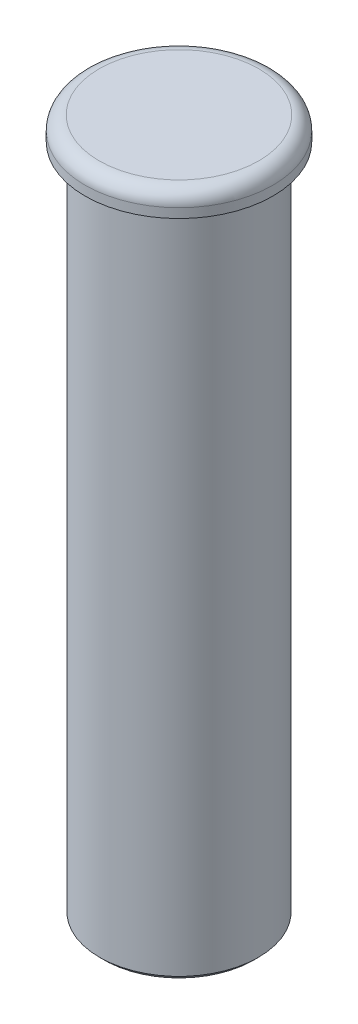
ISO-10303-21;
HEADER;
FILE_DESCRIPTION(('STEP AP214'),'2;1');
FILE_NAME('part.step','',(''),(''),'','','');
FILE_SCHEMA(('AUTOMOTIVE_DESIGN { 1 0 10303 214 1 1 1 1 }'));
ENDSEC;
DATA;
#1=APPLICATION_CONTEXT('core data for automotive mechanical design processes');
#2=APPLICATION_PROTOCOL_DEFINITION('international standard','automotive_design',2000,#1);
#3=PRODUCT_CONTEXT('',#1,'mechanical');
#4=PRODUCT('Part','Part','',(#3));
#5=PRODUCT_RELATED_PRODUCT_CATEGORY('part','',(#4));
#6=PRODUCT_DEFINITION_FORMATION('','',#4);
#7=PRODUCT_DEFINITION_CONTEXT('part definition',#1,'design');
#8=PRODUCT_DEFINITION('design','',#6,#7);
#9=PRODUCT_DEFINITION_SHAPE('','',#8);
#10=(LENGTH_UNIT() NAMED_UNIT(*) SI_UNIT(.MILLI.,.METRE.));
#11=(NAMED_UNIT(*) PLANE_ANGLE_UNIT() SI_UNIT($,.RADIAN.));
#12=(NAMED_UNIT(*) SI_UNIT($,.STERADIAN.) SOLID_ANGLE_UNIT());
#13=UNCERTAINTY_MEASURE_WITH_UNIT(LENGTH_MEASURE(1.E-05),#10,'distance_accuracy_value','');
#14=(GEOMETRIC_REPRESENTATION_CONTEXT(3) GLOBAL_UNCERTAINTY_ASSIGNED_CONTEXT((#13)) GLOBAL_UNIT_ASSIGNED_CONTEXT((#10,
#11,#12)) REPRESENTATION_CONTEXT('',''));
#15=CARTESIAN_POINT('',(0.,0.,0.));
#16=DIRECTION('',(0.,0.,1.));
#17=DIRECTION('',(1.,0.,0.));
#18=AXIS2_PLACEMENT_3D('',#15,#16,#17);
#19=CARTESIAN_POINT('',(0.,37.,0.));
#20=DIRECTION('',(0.,1.,0.));
#21=DIRECTION('',(0.,0.,1.));
#22=AXIS2_PLACEMENT_3D('',#19,#20,#21);
#23=CYLINDRICAL_SURFACE('',#22,9.99999999999999);
#24=CARTESIAN_POINT('',(0.,35.5,0.));
#25=DIRECTION('',(0.,1.,0.));
#26=DIRECTION('',(0.,0.,1.));
#27=AXIS2_PLACEMENT_3D('',#24,#25,#26);
#28=CIRCLE('',#27,9.99999999999999);
#29=CARTESIAN_POINT('',(0.,35.5,9.99999999999999));
#30=VERTEX_POINT('',#29);
#31=EDGE_CURVE('E51',#30,#30,#28,.F.);
#32=ORIENTED_EDGE('',*,*,#31,.T.);
#33=EDGE_LOOP('',(#32));
#34=FACE_BOUND('',#33,.T.);
#35=CARTESIAN_POINT('',(0.,34.5,0.));
#36=DIRECTION('',(0.,1.,0.));
#37=DIRECTION('',(0.,0.,1.));
#38=AXIS2_PLACEMENT_3D('',#35,#36,#37);
#39=CIRCLE('',#38,9.99999999999999);
#40=CARTESIAN_POINT('',(0.,34.5,9.99999999999999));
#41=VERTEX_POINT('',#40);
#42=EDGE_CURVE('E57',#41,#41,#39,.T.);
#43=ORIENTED_EDGE('',*,*,#42,.T.);
#44=EDGE_LOOP('',(#43));
#45=FACE_BOUND('',#44,.T.);
#46=ADVANCED_FACE('F31',(#34,#45),#23,.T.);
#47=CARTESIAN_POINT('',(-10.,37.,0.));
#48=DIRECTION('',(0.,1.,0.));
#49=DIRECTION('',(0.,0.,1.));
#50=AXIS2_PLACEMENT_3D('',#47,#48,#49);
#51=PLANE('',#50);
#52=CARTESIAN_POINT('',(0.,37.,0.));
#53=DIRECTION('',(0.,1.,0.));
#54=DIRECTION('',(0.,0.,1.));
#55=AXIS2_PLACEMENT_3D('',#52,#53,#54);
#56=CIRCLE('',#55,8.49999999999999);
#57=CARTESIAN_POINT('',(0.,37.,8.49999999999999));
#58=VERTEX_POINT('',#57);
#59=EDGE_CURVE('E54',#58,#58,#56,.T.);
#60=ORIENTED_EDGE('',*,*,#59,.T.);
#61=EDGE_LOOP('',(#60));
#62=FACE_BOUND('',#61,.T.);
#63=ADVANCED_FACE('F80',(#62),#51,.T.);
#64=CARTESIAN_POINT('',(0.,-37.,0.));
#65=DIRECTION('',(0.,-1.,0.));
#66=DIRECTION('',(0.,0.,-1.));
#67=AXIS2_PLACEMENT_3D('',#64,#65,#66);
#68=PLANE('',#67);
#69=CARTESIAN_POINT('',(0.,-37.,0.));
#70=DIRECTION('',(0.,-1.,0.));
#71=DIRECTION('',(0.,0.,-1.));
#72=AXIS2_PLACEMENT_3D('',#69,#70,#71);
#73=CIRCLE('',#72,7.94999999999998);
#74=CARTESIAN_POINT('',(0.,-37.,-7.94999999999998));
#75=VERTEX_POINT('',#74);
#76=EDGE_CURVE('E10',#75,#75,#73,.T.);
#77=ORIENTED_EDGE('',*,*,#76,.T.);
#78=EDGE_LOOP('',(#77));
#79=FACE_BOUND('',#78,.T.);
#80=ADVANCED_FACE('F77',(#79),#68,.T.);
#81=CARTESIAN_POINT('',(0.,37.,0.));
#82=DIRECTION('',(0.,1.,0.));
#83=DIRECTION('',(0.,0.,1.));
#84=AXIS2_PLACEMENT_3D('',#81,#82,#83);
#85=CYLINDRICAL_SURFACE('',#84,8.45);
#86=CARTESIAN_POINT('',(0.,-36.5,0.));
#87=DIRECTION('',(0.,-1.,0.));
#88=DIRECTION('',(0.,0.,-1.));
#89=AXIS2_PLACEMENT_3D('',#86,#87,#88);
#90=CIRCLE('',#89,8.45);
#91=CARTESIAN_POINT('',(0.,-36.5,-8.45));
#92=VERTEX_POINT('',#91);
#93=EDGE_CURVE('E38',#92,#92,#90,.F.);
#94=ORIENTED_EDGE('',*,*,#93,.T.);
#95=EDGE_LOOP('',(#94));
#96=FACE_BOUND('',#95,.T.);
#97=CARTESIAN_POINT('',(0.,34.,0.));
#98=DIRECTION('',(0.,-1.,0.));
#99=DIRECTION('',(0.,0.,-1.));
#100=AXIS2_PLACEMENT_3D('',#97,#98,#99);
#101=CIRCLE('',#100,8.45);
#102=CARTESIAN_POINT('',(0.,34.,-8.45));
#103=VERTEX_POINT('',#102);
#104=EDGE_CURVE('E42',#103,#103,#101,.T.);
#105=ORIENTED_EDGE('',*,*,#104,.T.);
#106=EDGE_LOOP('',(#105));
#107=FACE_BOUND('',#106,.T.);
#108=ADVANCED_FACE('F65',(#96,#107),#85,.T.);
#109=CARTESIAN_POINT('',(-8.45000000000001,34.5,0.));
#110=DIRECTION('',(0.,-1.,0.));
#111=DIRECTION('',(0.,0.,-1.));
#112=AXIS2_PLACEMENT_3D('',#109,#110,#111);
#113=PLANE('',#112);
#114=CARTESIAN_POINT('',(0.,34.5,0.));
#115=DIRECTION('',(0.,-1.,0.));
#116=DIRECTION('',(0.,0.,-1.));
#117=AXIS2_PLACEMENT_3D('',#114,#115,#116);
#118=CIRCLE('',#117,8.95);
#119=CARTESIAN_POINT('',(0.,34.5,-8.95));
#120=VERTEX_POINT('',#119);
#121=EDGE_CURVE('E46',#120,#120,#118,.F.);
#122=ORIENTED_EDGE('',*,*,#121,.T.);
#123=EDGE_LOOP('',(#122));
#124=FACE_BOUND('',#123,.T.);
#125=ORIENTED_EDGE('',*,*,#42,.F.);
#126=EDGE_LOOP('',(#125));
#127=FACE_BOUND('',#126,.T.);
#128=ADVANCED_FACE('F62',(#124,#127),#113,.T.);
#129=CARTESIAN_POINT('',(0.,35.5,0.));
#130=DIRECTION('',(0.,1.,0.));
#131=DIRECTION('',(0.,0.,1.));
#132=AXIS2_PLACEMENT_3D('',#129,#130,#131);
#133=TOROIDAL_SURFACE('',#132,8.49999999999999,1.5);
#134=ORIENTED_EDGE('',*,*,#31,.F.);
#135=EDGE_LOOP('',(#134));
#136=FACE_BOUND('',#135,.T.);
#137=ORIENTED_EDGE('',*,*,#59,.F.);
#138=EDGE_LOOP('',(#137));
#139=FACE_BOUND('',#138,.T.);
#140=ADVANCED_FACE('F64',(#136,#139),#133,.T.);
#141=CARTESIAN_POINT('',(0.,34.,0.));
#142=DIRECTION('',(0.,-1.,0.));
#143=DIRECTION('',(0.,0.,-1.));
#144=AXIS2_PLACEMENT_3D('',#141,#142,#143);
#145=TOROIDAL_SURFACE('',#144,8.95,0.5);
#146=ORIENTED_EDGE('',*,*,#104,.F.);
#147=EDGE_LOOP('',(#146));
#148=FACE_BOUND('',#147,.T.);
#149=ORIENTED_EDGE('',*,*,#121,.F.);
#150=EDGE_LOOP('',(#149));
#151=FACE_BOUND('',#150,.T.);
#152=ADVANCED_FACE('F73',(#148,#151),#145,.F.);
#153=CARTESIAN_POINT('',(0.,-36.5,0.));
#154=DIRECTION('',(0.,1.,0.));
#155=DIRECTION('',(0.,0.,1.));
#156=AXIS2_PLACEMENT_3D('',#153,#154,#155);
#157=CONICAL_SURFACE('',#156,8.45,0.785398163397455);
#158=ORIENTED_EDGE('',*,*,#76,.F.);
#159=EDGE_LOOP('',(#158));
#160=FACE_BOUND('',#159,.T.);
#161=ORIENTED_EDGE('',*,*,#93,.F.);
#162=EDGE_LOOP('',(#161));
#163=FACE_BOUND('',#162,.T.);
#164=ADVANCED_FACE('F33',(#160,#163),#157,.T.);
#165=CLOSED_SHELL('',(#46,#63,#80,#108,#128,#140,#152,#164));
#166=MANIFOLD_SOLID_BREP('B2',#165);
#167=ADVANCED_BREP_SHAPE_REPRESENTATION('',(#18,#166),#14);
#168=SHAPE_DEFINITION_REPRESENTATION(#9,#167);
ENDSEC;
END-ISO-10303-21;
